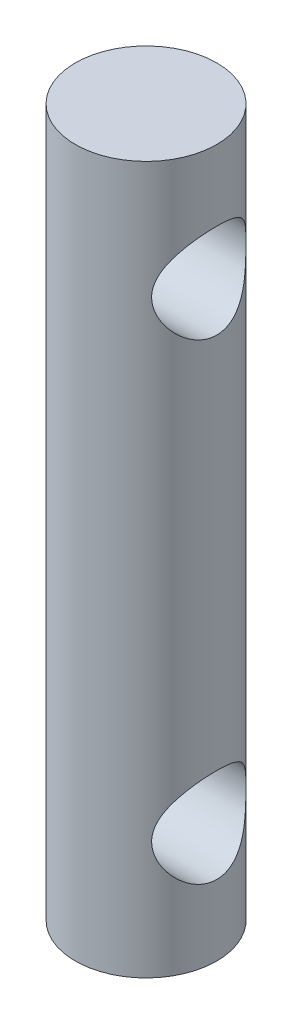
ISO-10303-21;
HEADER;
FILE_DESCRIPTION(('STEP AP214'),'2;1');
FILE_NAME('part.step','',(''),(''),'','','');
FILE_SCHEMA(('AUTOMOTIVE_DESIGN { 1 0 10303 214 1 1 1 1 }'));
ENDSEC;
DATA;
#1=APPLICATION_CONTEXT('core data for automotive mechanical design processes');
#2=APPLICATION_PROTOCOL_DEFINITION('international standard','automotive_design',2000,#1);
#3=PRODUCT_CONTEXT('',#1,'mechanical');
#4=PRODUCT('Part','Part','',(#3));
#5=PRODUCT_RELATED_PRODUCT_CATEGORY('part','',(#4));
#6=PRODUCT_DEFINITION_FORMATION('','',#4);
#7=PRODUCT_DEFINITION_CONTEXT('part definition',#1,'design');
#8=PRODUCT_DEFINITION('design','',#6,#7);
#9=PRODUCT_DEFINITION_SHAPE('','',#8);
#10=(LENGTH_UNIT() NAMED_UNIT(*) SI_UNIT(.MILLI.,.METRE.));
#11=(NAMED_UNIT(*) PLANE_ANGLE_UNIT() SI_UNIT($,.RADIAN.));
#12=(NAMED_UNIT(*) SI_UNIT($,.STERADIAN.) SOLID_ANGLE_UNIT());
#13=UNCERTAINTY_MEASURE_WITH_UNIT(LENGTH_MEASURE(1.E-05),#10,'distance_accuracy_value','');
#14=(GEOMETRIC_REPRESENTATION_CONTEXT(3) GLOBAL_UNCERTAINTY_ASSIGNED_CONTEXT((#13)) GLOBAL_UNIT_ASSIGNED_CONTEXT((#10,
#11,#12)) REPRESENTATION_CONTEXT('',''));
#15=CARTESIAN_POINT('',(0.,0.,0.));
#16=DIRECTION('',(0.,0.,1.));
#17=DIRECTION('',(1.,0.,0.));
#18=AXIS2_PLACEMENT_3D('',#15,#16,#17);
#19=CARTESIAN_POINT('',(0.,30.,0.));
#20=DIRECTION('',(0.,-1.,0.));
#21=DIRECTION('',(0.,0.,1.));
#22=AXIS2_PLACEMENT_3D('',#19,#20,#21);
#23=CYLINDRICAL_SURFACE('',#22,3.);
#24=CARTESIAN_POINT('',(-2.23606797749979,5.,2.));
#25=CARTESIAN_POINT('',(-2.23607753462816,5.09762831086862,1.99999453997731));
#26=CARTESIAN_POINT('',(-2.24258071047442,5.1952907537088,1.99278992503664));
#27=CARTESIAN_POINT('',(-2.26731972501617,5.38711991165081,1.96458268317731));
#28=CARTESIAN_POINT('',(-2.2855766081271,5.48128003552956,1.94355530587862));
#29=CARTESIAN_POINT('',(-2.3305658582557,5.66273544187768,1.88935861676632));
#30=CARTESIAN_POINT('',(-2.35721561794601,5.75008769673766,1.85630718014214));
#31=CARTESIAN_POINT('',(-2.41584094681825,5.91786583234666,1.77934008393538));
#32=CARTESIAN_POINT('',(-2.44781762158831,5.99829026997647,1.73542216812163));
#33=CARTESIAN_POINT('',(-2.51946072932026,6.16364688761691,1.63002410007714));
#34=CARTESIAN_POINT('',(-2.55954936090364,6.2473321177172,1.56687435451732));
#35=CARTESIAN_POINT('',(-2.63944827308083,6.40400270887428,1.4281921974068));
#36=CARTESIAN_POINT('',(-2.67925824297985,6.47697752165853,1.3526477317708));
#37=CARTESIAN_POINT('',(-2.76088818523747,6.62064365878166,1.17815690494296));
#38=CARTESIAN_POINT('',(-2.80216785846923,6.68948251177567,1.07740643965819));
#39=CARTESIAN_POINT('',(-2.87558484482764,6.80864209549007,0.862470964212232));
#40=CARTESIAN_POINT('',(-2.90773236231037,6.85898351403119,0.748301152321704));
#41=CARTESIAN_POINT('',(-2.95599907464725,6.93355640101745,0.523249073480003));
#42=CARTESIAN_POINT('',(-2.97351175615867,6.96008334449556,0.413434725181416));
#43=CARTESIAN_POINT('',(-2.99609745461921,6.99418448928365,0.189695448729862));
#44=CARTESIAN_POINT('',(-3.00118613762359,7.00178255922544,0.0757758812858249));
#45=CARTESIAN_POINT('',(-2.99855361722953,6.99782755005095,-0.13414705023233));
#46=CARTESIAN_POINT('',(-2.99266264910127,6.98901094868294,-0.230240638008753));
#47=CARTESIAN_POINT('',(-2.9720818279002,6.95790894864109,-0.419238633271016));
#48=CARTESIAN_POINT('',(-2.95739133313102,6.93562256769646,-0.512142807649724));
#49=CARTESIAN_POINT('',(-2.92052091703736,6.87880431520542,-0.692077937671169));
#50=CARTESIAN_POINT('',(-2.89837077982679,6.84432111480144,-0.779130623845962));
#51=CARTESIAN_POINT('',(-2.84821104476287,6.76444635704718,-0.946209150653556));
#52=CARTESIAN_POINT('',(-2.82020037745161,6.71905280849849,-1.0262337049694));
#53=CARTESIAN_POINT('',(-2.75618058450702,6.61202126254011,-1.18828429196344));
#54=CARTESIAN_POINT('',(-2.71960408792025,6.54903247664721,-1.26919148099708));
#55=CARTESIAN_POINT('',(-2.64400601826998,6.41210132051968,-1.41998807498305));
#56=CARTESIAN_POINT('',(-2.60498072815232,6.33814205406619,-1.48986013519457));
#57=CARTESIAN_POINT('',(-2.52150044944151,6.16803678978671,-1.62772235326165));
#58=CARTESIAN_POINT('',(-2.47714320008931,6.07022892028551,-1.69373593126354));
#59=CARTESIAN_POINT('',(-2.39475610831095,5.86249016077929,-1.80834874945483));
#60=CARTESIAN_POINT('',(-2.3567157153489,5.7525800055861,-1.85697718654898));
#61=CARTESIAN_POINT('',(-2.30262870306889,5.5552809379269,-1.92332724567776));
#62=CARTESIAN_POINT('',(-2.28340364577667,5.47040662994312,-1.94590791747533));
#63=CARTESIAN_POINT('',(-2.25409039789612,5.29696051018316,-1.97979555580014));
#64=CARTESIAN_POINT('',(-2.24398636782354,5.20839538882738,-1.99112206964395));
#65=CARTESIAN_POINT('',(-2.23447556987372,5.02955701355851,-2.00179400148877));
#66=CARTESIAN_POINT('',(-2.2351153386647,4.93927802147988,-2.00108729753098));
#67=CARTESIAN_POINT('',(-2.24709880368953,4.76031616604496,-1.98761629716365));
#68=CARTESIAN_POINT('',(-2.2584511764885,4.67163465589261,-1.97484222690381));
#69=CARTESIAN_POINT('',(-2.28927977500746,4.50261058245016,-1.93899811187046));
#70=CARTESIAN_POINT('',(-2.30833187069749,4.42207229099742,-1.91646174529973));
#71=CARTESIAN_POINT('',(-2.3522995853365,4.2658737639497,-1.86223041628513));
#72=CARTESIAN_POINT('',(-2.3772171729463,4.19021517703699,-1.83053237805351));
#73=CARTESIAN_POINT('',(-2.43611483596194,4.02979799615248,-1.75163346599563));
#74=CARTESIAN_POINT('',(-2.47091081434316,3.9462431884573,-1.70260028818246));
#75=CARTESIAN_POINT('',(-2.54262514806633,3.78758319738271,-1.59352731501438));
#76=CARTESIAN_POINT('',(-2.57954604947543,3.71248848325755,-1.53347411883828));
#77=CARTESIAN_POINT('',(-2.66075678321007,3.55603765253246,-1.38876657712435));
#78=CARTESIAN_POINT('',(-2.70489452138573,3.47689715175168,-1.30160386514207));
#79=CARTESIAN_POINT('',(-2.78775581841638,3.33418331705971,-1.11309948866219));
#80=CARTESIAN_POINT('',(-2.82648414789457,3.27059622874327,-1.01177047745701));
#81=CARTESIAN_POINT('',(-2.88790821242222,3.17210826108241,-0.817487474821799));
#82=CARTESIAN_POINT('',(-2.91225458111008,3.13404349555963,-0.726662364886322));
#83=CARTESIAN_POINT('',(-2.95278707867041,3.07139280567956,-0.538757079020517));
#84=CARTESIAN_POINT('',(-2.96898009871993,3.04679549714023,-0.441682263858772));
#85=CARTESIAN_POINT('',(-2.99178364026746,3.01230303616124,-0.243369392303446));
#86=CARTESIAN_POINT('',(-2.99835150856533,3.00247332049332,-0.142114836924321));
#87=CARTESIAN_POINT('',(-3.00109821029056,2.99835214858289,0.0608555465807296));
#88=CARTESIAN_POINT('',(-2.99727800938902,3.00405924804382,0.162571330953445));
#89=CARTESIAN_POINT('',(-2.98029555977324,3.0296594890047,0.355757532528103));
#90=CARTESIAN_POINT('',(-2.96783277209856,3.0484909848618,0.447435143070527));
#91=CARTESIAN_POINT('',(-2.93536106206933,3.09823800943089,0.626018422997059));
#92=CARTESIAN_POINT('',(-2.91535096747103,3.12915541534726,0.712923348686888));
#93=CARTESIAN_POINT('',(-2.86791765486194,3.20393870488402,0.885147296608349));
#94=CARTESIAN_POINT('',(-2.84013248946338,3.24845030749508,0.970083589200263));
#95=CARTESIAN_POINT('',(-2.77975408235472,3.34815064462598,1.13155266268318));
#96=CARTESIAN_POINT('',(-2.74715796645263,3.403345767952,1.20808037205002));
#97=CARTESIAN_POINT('',(-2.67392931472394,3.53262890233631,1.36329422201402));
#98=CARTESIAN_POINT('',(-2.6328391387737,3.60832302367403,1.44042679526091));
#99=CARTESIAN_POINT('',(-2.55053357649486,3.77111354154583,1.58160022281595));
#100=CARTESIAN_POINT('',(-2.50931811970155,3.85821838883409,1.64563128323923));
#101=CARTESIAN_POINT('',(-2.43384213590298,4.03586759075529,1.75513253518411));
#102=CARTESIAN_POINT('',(-2.39929086741904,4.12564180995034,1.8016464689721));
#103=CARTESIAN_POINT('',(-2.33747501591023,4.31328444899315,1.88115802340272));
#104=CARTESIAN_POINT('',(-2.31019631295305,4.41113669386215,1.91418190281333));
#105=CARTESIAN_POINT('',(-2.27191051929539,4.59077146842454,1.95936262470908));
#106=CARTESIAN_POINT('',(-2.25863695410151,4.67130823679029,1.97452228373248));
#107=CARTESIAN_POINT('',(-2.24071519216009,4.83455640050454,1.99483915818926));
#108=CARTESIAN_POINT('',(-2.23605987841475,4.91726594426058,2.00000462703715));
#109=CARTESIAN_POINT('',(-2.23606797749979,5.,2.));
#110=B_SPLINE_CURVE_WITH_KNOTS('',3,(#24,#25,#26,#27,#28,#29,#30,#31,#32,#33,#34,#35,#36,#37,
#38,#39,#40,#41,#42,#43,#44,#45,#46,#47,#48,#49,#50,#51,#52,#53,#54,#55,#56,#57,#58,#59,#60,#61,
#62,#63,#64,#65,#66,#67,#68,#69,#70,#71,#72,#73,#74,#75,#76,#77,#78,#79,#80,#81,#82,#83,#84,#85,
#86,#87,#88,#89,#90,#91,#92,#93,#94,#95,#96,#97,#98,#99,#100,#101,#102,#103,#104,#105,#106,#107,
#108,#109),.UNSPECIFIED.,.T.,.F.,(4,2,2,2,2,2,2,2,2,2,2,2,2,2,2,2,2,2,2,2,2,2,2,2,2,2,2,2,2,2,2,
2,2,2,2,2,2,2,2,2,2,2,4),(0.,0.292506930722152,0.585539042259288,0.875772651216275,
1.16606657266549,1.50154677068638,1.83735518436276,2.2216703100629,2.6055542938858,
2.9463748206358,3.28676536688298,3.57539534955742,3.86404638283746,4.15155831973191,
4.43912276903,4.76447525946635,5.09033414796639,5.46678703504944,5.84260469743948,
6.11126090401325,6.37944966235487,6.64880037638036,6.91836943570598,7.17476451706936,
7.43124577644958,7.73899230052352,8.04711556801509,8.42254684520963,8.79764490572581,
9.10070580611699,9.40351012888472,9.70765229266165,10.0117661844615,10.2937678224973,
10.5758132789284,10.874178629859,11.1727229593109,11.5182220628451,11.863978504186,
12.1833412579672,12.5020793664923,12.7501661630426,12.9980479966543),.UNSPECIFIED.);
#111=CARTESIAN_POINT('',(-2.23606797749979,5.,2.));
#112=VERTEX_POINT('',#111);
#113=EDGE_CURVE('E37',#112,#112,#110,.T.);
#114=ORIENTED_EDGE('',*,*,#113,.F.);
#115=EDGE_LOOP('',(#114));
#116=FACE_BOUND('',#115,.T.);
#117=CARTESIAN_POINT('',(2.23606797749979,5.,2.));
#118=CARTESIAN_POINT('',(2.23607753462816,4.90237168913138,1.99999453997731));
#119=CARTESIAN_POINT('',(2.24258071047442,4.8047092462912,1.99278992503664));
#120=CARTESIAN_POINT('',(2.26731972501617,4.61288008834918,1.96458268317731));
#121=CARTESIAN_POINT('',(2.2855766081271,4.51871996447043,1.94355530587862));
#122=CARTESIAN_POINT('',(2.3305658582557,4.33726455812231,1.88935861676632));
#123=CARTESIAN_POINT('',(2.35721561794601,4.24991230326234,1.85630718014214));
#124=CARTESIAN_POINT('',(2.41584094681825,4.08213416765333,1.77934008393539));
#125=CARTESIAN_POINT('',(2.44781762158831,4.00170973002352,1.73542216812163));
#126=CARTESIAN_POINT('',(2.51946072932026,3.83635311238309,1.63002410007714));
#127=CARTESIAN_POINT('',(2.55954936090364,3.7526678822828,1.56687435451732));
#128=CARTESIAN_POINT('',(2.63944827308082,3.59599729112572,1.4281921974068));
#129=CARTESIAN_POINT('',(2.67925824297985,3.52302247834147,1.3526477317708));
#130=CARTESIAN_POINT('',(2.76088818523747,3.37935634121833,1.17815690494296));
#131=CARTESIAN_POINT('',(2.80216785846923,3.31051748822433,1.07740643965819));
#132=CARTESIAN_POINT('',(2.87558484482764,3.19135790450993,0.862470964212235));
#133=CARTESIAN_POINT('',(2.90773236231037,3.14101648596881,0.748301152321707));
#134=CARTESIAN_POINT('',(2.95599907464725,3.06644359898254,0.523249073480006));
#135=CARTESIAN_POINT('',(2.97351175615867,3.03991665550444,0.413434725181419));
#136=CARTESIAN_POINT('',(2.99609745461921,3.00581551071635,0.189695448729864));
#137=CARTESIAN_POINT('',(3.00118613762359,2.99821744077456,0.075775881285827));
#138=CARTESIAN_POINT('',(2.99855361722953,3.00217244994905,-0.134147050232328));
#139=CARTESIAN_POINT('',(2.99266264910127,3.01098905131706,-0.230240638008751));
#140=CARTESIAN_POINT('',(2.9720818279002,3.0420910513589,-0.419238633271014));
#141=CARTESIAN_POINT('',(2.95739133313102,3.06437743230354,-0.512142807649723));
#142=CARTESIAN_POINT('',(2.92052091703736,3.12119568479457,-0.692077937671168));
#143=CARTESIAN_POINT('',(2.89837077982679,3.15567888519855,-0.779130623845961));
#144=CARTESIAN_POINT('',(2.84821104476287,3.23555364295281,-0.946209150653555));
#145=CARTESIAN_POINT('',(2.82020037745161,3.28094719150151,-1.0262337049694));
#146=CARTESIAN_POINT('',(2.75618058450702,3.38797873745989,-1.18828429196344));
#147=CARTESIAN_POINT('',(2.71960408792025,3.45096752335278,-1.26919148099708));
#148=CARTESIAN_POINT('',(2.64400601826998,3.58789867948032,-1.41998807498305));
#149=CARTESIAN_POINT('',(2.60498072815232,3.66185794593381,-1.48986013519457));
#150=CARTESIAN_POINT('',(2.52150044944151,3.83196321021329,-1.62772235326165));
#151=CARTESIAN_POINT('',(2.47714320008932,3.92977107971448,-1.69373593126354));
#152=CARTESIAN_POINT('',(2.39475610831095,4.13750983922071,-1.80834874945483));
#153=CARTESIAN_POINT('',(2.3567157153489,4.2474199944139,-1.85697718654898));
#154=CARTESIAN_POINT('',(2.30262870306889,4.4447190620731,-1.92332724567776));
#155=CARTESIAN_POINT('',(2.28340364577667,4.52959337005687,-1.94590791747533));
#156=CARTESIAN_POINT('',(2.25409039789612,4.70303948981683,-1.97979555580014));
#157=CARTESIAN_POINT('',(2.24398636782354,4.79160461117262,-1.99112206964395));
#158=CARTESIAN_POINT('',(2.23447556987372,4.97044298644149,-2.00179400148877));
#159=CARTESIAN_POINT('',(2.2351153386647,5.06072197852012,-2.00108729753098));
#160=CARTESIAN_POINT('',(2.24709880368953,5.23968383395504,-1.98761629716365));
#161=CARTESIAN_POINT('',(2.2584511764885,5.32836534410738,-1.97484222690381));
#162=CARTESIAN_POINT('',(2.28927977500746,5.49738941754983,-1.93899811187046));
#163=CARTESIAN_POINT('',(2.30833187069749,5.57792770900257,-1.91646174529973));
#164=CARTESIAN_POINT('',(2.3522995853365,5.73412623605029,-1.86223041628513));
#165=CARTESIAN_POINT('',(2.3772171729463,5.80978482296301,-1.83053237805352));
#166=CARTESIAN_POINT('',(2.43611483596194,5.97020200384751,-1.75163346599563));
#167=CARTESIAN_POINT('',(2.47091081434316,6.05375681154269,-1.70260028818246));
#168=CARTESIAN_POINT('',(2.54262514806633,6.21241680261729,-1.59352731501439));
#169=CARTESIAN_POINT('',(2.57954604947543,6.28751151674245,-1.53347411883828));
#170=CARTESIAN_POINT('',(2.66075678321007,6.44396234746753,-1.38876657712435));
#171=CARTESIAN_POINT('',(2.70489452138573,6.52310284824831,-1.30160386514207));
#172=CARTESIAN_POINT('',(2.78775581841638,6.66581668294029,-1.1130994886622));
#173=CARTESIAN_POINT('',(2.82648414789457,6.72940377125672,-1.01177047745701));
#174=CARTESIAN_POINT('',(2.88790821242222,6.82789173891759,-0.817487474821802));
#175=CARTESIAN_POINT('',(2.91225458111008,6.86595650444036,-0.726662364886326));
#176=CARTESIAN_POINT('',(2.95278707867041,6.92860719432044,-0.538757079020521));
#177=CARTESIAN_POINT('',(2.96898009871993,6.95320450285976,-0.441682263858775));
#178=CARTESIAN_POINT('',(2.99178364026746,6.98769696383875,-0.243369392303448));
#179=CARTESIAN_POINT('',(2.99835150856532,6.99752667950667,-0.142114836924323));
#180=CARTESIAN_POINT('',(3.00109821029056,7.0016478514171,0.0608555465807275));
#181=CARTESIAN_POINT('',(2.99727800938902,6.99594075195618,0.162571330953444));
#182=CARTESIAN_POINT('',(2.98029555977324,6.9703405109953,0.355757532528102));
#183=CARTESIAN_POINT('',(2.96783277209856,6.95150901513819,0.447435143070527));
#184=CARTESIAN_POINT('',(2.93536106206933,6.9017619905691,0.626018422997059));
#185=CARTESIAN_POINT('',(2.91535096747103,6.87084458465274,0.712923348686887));
#186=CARTESIAN_POINT('',(2.86791765486194,6.79606129511597,0.885147296608349));
#187=CARTESIAN_POINT('',(2.84013248946338,6.75154969250492,0.970083589200263));
#188=CARTESIAN_POINT('',(2.77975408235472,6.65184935537401,1.13155266268318));
#189=CARTESIAN_POINT('',(2.74715796645263,6.596654232048,1.20808037205002));
#190=CARTESIAN_POINT('',(2.67392931472394,6.46737109766369,1.36329422201402));
#191=CARTESIAN_POINT('',(2.6328391387737,6.39167697632596,1.44042679526091));
#192=CARTESIAN_POINT('',(2.55053357649486,6.22888645845416,1.58160022281596));
#193=CARTESIAN_POINT('',(2.50931811970155,6.14178161116591,1.64563128323923));
#194=CARTESIAN_POINT('',(2.43384213590298,5.96413240924471,1.75513253518411));
#195=CARTESIAN_POINT('',(2.39929086741904,5.87435819004966,1.8016464689721));
#196=CARTESIAN_POINT('',(2.33747501591023,5.68671555100684,1.88115802340272));
#197=CARTESIAN_POINT('',(2.31019631295305,5.58886330613785,1.91418190281333));
#198=CARTESIAN_POINT('',(2.27191051929539,5.40922853157545,1.95936262470908));
#199=CARTESIAN_POINT('',(2.25863695410151,5.3286917632097,1.97452228373248));
#200=CARTESIAN_POINT('',(2.24071519216009,5.16544359949546,1.99483915818926));
#201=CARTESIAN_POINT('',(2.23605987841475,5.08273405573942,2.00000462703715));
#202=CARTESIAN_POINT('',(2.23606797749979,5.,2.));
#203=B_SPLINE_CURVE_WITH_KNOTS('',3,(#117,#118,#119,#120,#121,#122,#123,#124,#125,#126,#127,
#128,#129,#130,#131,#132,#133,#134,#135,#136,#137,#138,#139,#140,#141,#142,#143,#144,#145,#146,
#147,#148,#149,#150,#151,#152,#153,#154,#155,#156,#157,#158,#159,#160,#161,#162,#163,#164,#165,
#166,#167,#168,#169,#170,#171,#172,#173,#174,#175,#176,#177,#178,#179,#180,#181,#182,#183,#184,
#185,#186,#187,#188,#189,#190,#191,#192,#193,#194,#195,#196,#197,#198,#199,#200,#201,#202),
.UNSPECIFIED.,.T.,.F.,(4,2,2,2,2,2,2,2,2,2,2,2,2,2,2,2,2,2,2,2,2,2,2,2,2,2,2,2,2,2,2,2,2,2,2,2,
2,2,2,2,2,2,4),(0.,0.292506930722152,0.585539042259287,0.875772651216273,1.16606657266549,
1.50154677068638,1.83735518436275,2.22167031006289,2.6055542938858,2.94637482063579,
3.28676536688298,3.57539534955742,3.86404638283746,4.15155831973191,4.43912276903,
4.76447525946635,5.09033414796639,5.46678703504944,5.84260469743948,6.11126090401325,
6.37944966235487,6.64880037638037,6.91836943570598,7.17476451706936,7.43124577644958,
7.73899230052352,8.04711556801509,8.42254684520963,8.7976449057258,9.10070580611698,
9.40351012888472,9.70765229266165,10.0117661844615,10.2937678224973,10.5758132789284,
10.874178629859,11.1727229593109,11.5182220628451,11.863978504186,12.1833412579672,
12.5020793664923,12.7501661630426,12.9980479966543),.UNSPECIFIED.);
#204=CARTESIAN_POINT('',(2.23606797749979,5.,2.));
#205=VERTEX_POINT('',#204);
#206=EDGE_CURVE('E89',#205,#205,#203,.T.);
#207=ORIENTED_EDGE('',*,*,#206,.F.);
#208=EDGE_LOOP('',(#207));
#209=FACE_BOUND('',#208,.T.);
#210=CARTESIAN_POINT('',(-2.23606797749979,25.,2.));
#211=CARTESIAN_POINT('',(-2.23607753462816,25.0976283108686,1.99999453997731));
#212=CARTESIAN_POINT('',(-2.24258071047442,25.1952907537088,1.99278992503664));
#213=CARTESIAN_POINT('',(-2.26731972501617,25.3871199116508,1.96458268317731));
#214=CARTESIAN_POINT('',(-2.2855766081271,25.4812800355296,1.94355530587863));
#215=CARTESIAN_POINT('',(-2.3305658582557,25.6627354418777,1.88935861676632));
#216=CARTESIAN_POINT('',(-2.35721561794601,25.7500876967377,1.85630718014214));
#217=CARTESIAN_POINT('',(-2.41584094681825,25.9178658323467,1.77934008393538));
#218=CARTESIAN_POINT('',(-2.44781762158831,25.9982902699765,1.73542216812163));
#219=CARTESIAN_POINT('',(-2.51946072932026,26.1636468876169,1.63002410007714));
#220=CARTESIAN_POINT('',(-2.55954936090364,26.2473321177172,1.56687435451732));
#221=CARTESIAN_POINT('',(-2.63944827308082,26.4040027088743,1.4281921974068));
#222=CARTESIAN_POINT('',(-2.67925824297985,26.4769775216585,1.3526477317708));
#223=CARTESIAN_POINT('',(-2.76088818523747,26.6206436587817,1.17815690494296));
#224=CARTESIAN_POINT('',(-2.80216785846923,26.6894825117757,1.07740643965819));
#225=CARTESIAN_POINT('',(-2.87558484482764,26.8086420954901,0.862470964212235));
#226=CARTESIAN_POINT('',(-2.90773236231037,26.8589835140312,0.748301152321706));
#227=CARTESIAN_POINT('',(-2.95599907464725,26.9335564010175,0.523249073480004));
#228=CARTESIAN_POINT('',(-2.97351175615867,26.9600833444956,0.413434725181418));
#229=CARTESIAN_POINT('',(-2.99609745461921,26.9941844892837,0.189695448729863));
#230=CARTESIAN_POINT('',(-3.00118613762359,27.0017825592254,0.0757758812858258));
#231=CARTESIAN_POINT('',(-2.99855361722953,26.9978275500509,-0.134147050232329));
#232=CARTESIAN_POINT('',(-2.99266264910127,26.9890109486829,-0.230240638008751));
#233=CARTESIAN_POINT('',(-2.9720818279002,26.9579089486411,-0.419238633271014));
#234=CARTESIAN_POINT('',(-2.95739133313102,26.9356225676965,-0.512142807649723));
#235=CARTESIAN_POINT('',(-2.92052091703736,26.8788043152054,-0.692077937671169));
#236=CARTESIAN_POINT('',(-2.89837077982679,26.8443211148014,-0.779130623845961));
#237=CARTESIAN_POINT('',(-2.84821104476287,26.7644463570472,-0.946209150653556));
#238=CARTESIAN_POINT('',(-2.82020037745161,26.7190528084985,-1.0262337049694));
#239=CARTESIAN_POINT('',(-2.75618058450702,26.6120212625401,-1.18828429196344));
#240=CARTESIAN_POINT('',(-2.71960408792025,26.5490324766472,-1.26919148099708));
#241=CARTESIAN_POINT('',(-2.64400601826998,26.4121013205197,-1.41998807498305));
#242=CARTESIAN_POINT('',(-2.60498072815232,26.3381420540662,-1.48986013519457));
#243=CARTESIAN_POINT('',(-2.52150044944152,26.1680367897867,-1.62772235326165));
#244=CARTESIAN_POINT('',(-2.47714320008932,26.0702289202855,-1.69373593126354));
#245=CARTESIAN_POINT('',(-2.39475610831095,25.8624901607793,-1.80834874945483));
#246=CARTESIAN_POINT('',(-2.3567157153489,25.7525800055861,-1.85697718654898));
#247=CARTESIAN_POINT('',(-2.30262870306889,25.5552809379269,-1.92332724567776));
#248=CARTESIAN_POINT('',(-2.28340364577667,25.4704066299431,-1.94590791747533));
#249=CARTESIAN_POINT('',(-2.25409039789612,25.2969605101832,-1.97979555580014));
#250=CARTESIAN_POINT('',(-2.24398636782354,25.2083953888274,-1.99112206964395));
#251=CARTESIAN_POINT('',(-2.23447556987372,25.0295570135585,-2.00179400148877));
#252=CARTESIAN_POINT('',(-2.2351153386647,24.9392780214799,-2.00108729753098));
#253=CARTESIAN_POINT('',(-2.24709880368953,24.760316166045,-1.98761629716365));
#254=CARTESIAN_POINT('',(-2.2584511764885,24.6716346558926,-1.97484222690381));
#255=CARTESIAN_POINT('',(-2.28927977500746,24.5026105824502,-1.93899811187046));
#256=CARTESIAN_POINT('',(-2.30833187069749,24.4220722909974,-1.91646174529973));
#257=CARTESIAN_POINT('',(-2.3522995853365,24.2658737639497,-1.86223041628513));
#258=CARTESIAN_POINT('',(-2.3772171729463,24.190215177037,-1.83053237805352));
#259=CARTESIAN_POINT('',(-2.43611483596194,24.0297979961525,-1.75163346599563));
#260=CARTESIAN_POINT('',(-2.47091081434316,23.9462431884573,-1.70260028818246));
#261=CARTESIAN_POINT('',(-2.54262514806633,23.7875831973827,-1.59352731501439));
#262=CARTESIAN_POINT('',(-2.57954604947543,23.7124884832575,-1.53347411883828));
#263=CARTESIAN_POINT('',(-2.66075678321007,23.5560376525325,-1.38876657712435));
#264=CARTESIAN_POINT('',(-2.70489452138573,23.4768971517517,-1.30160386514207));
#265=CARTESIAN_POINT('',(-2.78775581841638,23.3341833170597,-1.11309948866219));
#266=CARTESIAN_POINT('',(-2.82648414789457,23.2705962287433,-1.011770477457));
#267=CARTESIAN_POINT('',(-2.88790821242222,23.1721082610824,-0.817487474821798));
#268=CARTESIAN_POINT('',(-2.91225458111008,23.1340434955596,-0.726662364886322));
#269=CARTESIAN_POINT('',(-2.95278707867041,23.0713928056796,-0.538757079020516));
#270=CARTESIAN_POINT('',(-2.96898009871993,23.0467954971402,-0.44168226385877));
#271=CARTESIAN_POINT('',(-2.99178364026746,23.0123030361612,-0.243369392303444));
#272=CARTESIAN_POINT('',(-2.99835150856533,23.0024733204933,-0.142114836924318));
#273=CARTESIAN_POINT('',(-3.00109821029056,22.9983521485829,0.060855546580732));
#274=CARTESIAN_POINT('',(-2.99727800938901,23.0040592480438,0.162571330953447));
#275=CARTESIAN_POINT('',(-2.98029555977324,23.0296594890047,0.355757532528106));
#276=CARTESIAN_POINT('',(-2.96783277209856,23.0484909848618,0.44743514307053));
#277=CARTESIAN_POINT('',(-2.93536106206933,23.0982380094309,0.626018422997062));
#278=CARTESIAN_POINT('',(-2.91535096747103,23.1291554153473,0.712923348686889));
#279=CARTESIAN_POINT('',(-2.86791765486194,23.203938704884,0.885147296608351));
#280=CARTESIAN_POINT('',(-2.84013248946338,23.2484503074951,0.970083589200266));
#281=CARTESIAN_POINT('',(-2.77975408235472,23.348150644626,1.13155266268318));
#282=CARTESIAN_POINT('',(-2.74715796645263,23.403345767952,1.20808037205002));
#283=CARTESIAN_POINT('',(-2.67392931472394,23.5326289023363,1.36329422201402));
#284=CARTESIAN_POINT('',(-2.6328391387737,23.608323023674,1.44042679526091));
#285=CARTESIAN_POINT('',(-2.55053357649486,23.7711135415458,1.58160022281596));
#286=CARTESIAN_POINT('',(-2.50931811970154,23.8582183888341,1.64563128323923));
#287=CARTESIAN_POINT('',(-2.43384213590298,24.0358675907553,1.75513253518411));
#288=CARTESIAN_POINT('',(-2.39929086741904,24.1256418099503,1.8016464689721));
#289=CARTESIAN_POINT('',(-2.33747501591022,24.3132844489932,1.88115802340273));
#290=CARTESIAN_POINT('',(-2.31019631295305,24.4111366938622,1.91418190281333));
#291=CARTESIAN_POINT('',(-2.27191051929539,24.5907714684246,1.95936262470908));
#292=CARTESIAN_POINT('',(-2.25863695410151,24.6713082367903,1.97452228373248));
#293=CARTESIAN_POINT('',(-2.24071519216008,24.8345564005045,1.99483915818926));
#294=CARTESIAN_POINT('',(-2.23605987841475,24.9172659442606,2.00000462703715));
#295=CARTESIAN_POINT('',(-2.23606797749979,25.,2.));
#296=B_SPLINE_CURVE_WITH_KNOTS('',3,(#210,#211,#212,#213,#214,#215,#216,#217,#218,#219,#220,
#221,#222,#223,#224,#225,#226,#227,#228,#229,#230,#231,#232,#233,#234,#235,#236,#237,#238,#239,
#240,#241,#242,#243,#244,#245,#246,#247,#248,#249,#250,#251,#252,#253,#254,#255,#256,#257,#258,
#259,#260,#261,#262,#263,#264,#265,#266,#267,#268,#269,#270,#271,#272,#273,#274,#275,#276,#277,
#278,#279,#280,#281,#282,#283,#284,#285,#286,#287,#288,#289,#290,#291,#292,#293,#294,#295),
.UNSPECIFIED.,.T.,.F.,(4,2,2,2,2,2,2,2,2,2,2,2,2,2,2,2,2,2,2,2,2,2,2,2,2,2,2,2,2,2,2,2,2,2,2,2,
2,2,2,2,2,2,4),(0.,0.292506930722154,0.585539042259287,0.875772651216276,1.16606657266549,
1.50154677068638,1.83735518436275,2.22167031006289,2.6055542938858,2.9463748206358,
3.28676536688298,3.57539534955742,3.86404638283746,4.15155831973191,4.43912276903,
4.76447525946635,5.09033414796639,5.46678703504944,5.84260469743948,6.11126090401324,
6.37944966235487,6.64880037638037,6.91836943570598,7.17476451706936,7.43124577644958,
7.73899230052352,8.0471155680151,8.42254684520964,8.79764490572581,9.10070580611699,
9.40351012888473,9.70765229266166,10.0117661844615,10.2937678224973,10.5758132789284,
10.874178629859,11.1727229593109,11.5182220628452,11.8639785041861,12.1833412579672,
12.5020793664923,12.7501661630426,12.9980479966543),.UNSPECIFIED.);
#297=CARTESIAN_POINT('',(-2.23606797749979,25.,2.));
#298=VERTEX_POINT('',#297);
#299=EDGE_CURVE('E50',#298,#298,#296,.T.);
#300=ORIENTED_EDGE('',*,*,#299,.F.);
#301=EDGE_LOOP('',(#300));
#302=FACE_BOUND('',#301,.T.);
#303=CARTESIAN_POINT('',(2.23606797749979,25.,2.));
#304=CARTESIAN_POINT('',(2.23607753462816,24.9023716891314,1.99999453997731));
#305=CARTESIAN_POINT('',(2.24258071047442,24.8047092462912,1.99278992503664));
#306=CARTESIAN_POINT('',(2.26731972501617,24.6128800883492,1.96458268317731));
#307=CARTESIAN_POINT('',(2.2855766081271,24.5187199644704,1.94355530587863));
#308=CARTESIAN_POINT('',(2.3305658582557,24.3372645581223,1.88935861676632));
#309=CARTESIAN_POINT('',(2.35721561794601,24.2499123032623,1.85630718014214));
#310=CARTESIAN_POINT('',(2.41584094681825,24.0821341676533,1.77934008393539));
#311=CARTESIAN_POINT('',(2.44781762158831,24.0017097300235,1.73542216812163));
#312=CARTESIAN_POINT('',(2.51946072932026,23.8363531123831,1.63002410007714));
#313=CARTESIAN_POINT('',(2.55954936090363,23.7526678822828,1.56687435451732));
#314=CARTESIAN_POINT('',(2.63944827308082,23.5959972911257,1.4281921974068));
#315=CARTESIAN_POINT('',(2.67925824297985,23.5230224783415,1.3526477317708));
#316=CARTESIAN_POINT('',(2.76088818523747,23.3793563412183,1.17815690494296));
#317=CARTESIAN_POINT('',(2.80216785846923,23.3105174882243,1.07740643965819));
#318=CARTESIAN_POINT('',(2.87558484482764,23.1913579045099,0.862470964212235));
#319=CARTESIAN_POINT('',(2.90773236231037,23.1410164859688,0.748301152321706));
#320=CARTESIAN_POINT('',(2.95599907464725,23.0664435989825,0.523249073480005));
#321=CARTESIAN_POINT('',(2.97351175615867,23.0399166555044,0.413434725181418));
#322=CARTESIAN_POINT('',(2.99609745461921,23.0058155107163,0.189695448729863));
#323=CARTESIAN_POINT('',(3.00118613762359,22.9982174407746,0.0757758812858258));
#324=CARTESIAN_POINT('',(2.99855361722953,23.0021724499491,-0.134147050232329));
#325=CARTESIAN_POINT('',(2.99266264910127,23.0109890513171,-0.230240638008752));
#326=CARTESIAN_POINT('',(2.9720818279002,23.0420910513589,-0.419238633271015));
#327=CARTESIAN_POINT('',(2.95739133313102,23.0643774323035,-0.512142807649724));
#328=CARTESIAN_POINT('',(2.92052091703736,23.1211956847946,-0.692077937671169));
#329=CARTESIAN_POINT('',(2.89837077982679,23.1556788851986,-0.779130623845962));
#330=CARTESIAN_POINT('',(2.84821104476287,23.2355536429528,-0.946209150653557));
#331=CARTESIAN_POINT('',(2.82020037745161,23.2809471915015,-1.0262337049694));
#332=CARTESIAN_POINT('',(2.75618058450702,23.3879787374599,-1.18828429196344));
#333=CARTESIAN_POINT('',(2.71960408792025,23.4509675233528,-1.26919148099708));
#334=CARTESIAN_POINT('',(2.64400601826998,23.5878986794803,-1.41998807498305));
#335=CARTESIAN_POINT('',(2.60498072815232,23.6618579459338,-1.48986013519457));
#336=CARTESIAN_POINT('',(2.52150044944151,23.8319632102133,-1.62772235326165));
#337=CARTESIAN_POINT('',(2.47714320008931,23.9297710797145,-1.69373593126354));
#338=CARTESIAN_POINT('',(2.39475610831095,24.1375098392207,-1.80834874945483));
#339=CARTESIAN_POINT('',(2.35671571534889,24.2474199944139,-1.85697718654898));
#340=CARTESIAN_POINT('',(2.30262870306889,24.4447190620731,-1.92332724567776));
#341=CARTESIAN_POINT('',(2.28340364577667,24.5295933700569,-1.94590791747533));
#342=CARTESIAN_POINT('',(2.25409039789612,24.7030394898168,-1.97979555580014));
#343=CARTESIAN_POINT('',(2.24398636782354,24.7916046111726,-1.99112206964395));
#344=CARTESIAN_POINT('',(2.23447556987372,24.9704429864415,-2.00179400148877));
#345=CARTESIAN_POINT('',(2.2351153386647,25.0607219785201,-2.00108729753098));
#346=CARTESIAN_POINT('',(2.24709880368953,25.239683833955,-1.98761629716365));
#347=CARTESIAN_POINT('',(2.2584511764885,25.3283653441074,-1.97484222690381));
#348=CARTESIAN_POINT('',(2.28927977500746,25.4973894175498,-1.93899811187046));
#349=CARTESIAN_POINT('',(2.30833187069749,25.5779277090026,-1.91646174529973));
#350=CARTESIAN_POINT('',(2.3522995853365,25.7341262360503,-1.86223041628513));
#351=CARTESIAN_POINT('',(2.3772171729463,25.809784822963,-1.83053237805352));
#352=CARTESIAN_POINT('',(2.43611483596194,25.9702020038475,-1.75163346599563));
#353=CARTESIAN_POINT('',(2.47091081434316,26.0537568115427,-1.70260028818246));
#354=CARTESIAN_POINT('',(2.54262514806633,26.2124168026173,-1.59352731501439));
#355=CARTESIAN_POINT('',(2.57954604947543,26.2875115167425,-1.53347411883828));
#356=CARTESIAN_POINT('',(2.66075678321007,26.4439623474675,-1.38876657712436));
#357=CARTESIAN_POINT('',(2.70489452138573,26.5231028482483,-1.30160386514208));
#358=CARTESIAN_POINT('',(2.78775581841637,26.6658166829403,-1.1130994886622));
#359=CARTESIAN_POINT('',(2.82648414789457,26.7294037712567,-1.01177047745701));
#360=CARTESIAN_POINT('',(2.88790821242221,26.8278917389176,-0.817487474821806));
#361=CARTESIAN_POINT('',(2.91225458111008,26.8659565044404,-0.72666236488633));
#362=CARTESIAN_POINT('',(2.95278707867041,26.9286071943204,-0.538757079020524));
#363=CARTESIAN_POINT('',(2.96898009871993,26.9532045028598,-0.441682263858778));
#364=CARTESIAN_POINT('',(2.99178364026746,26.9876969638388,-0.243369392303451));
#365=CARTESIAN_POINT('',(2.99835150856532,26.9975266795067,-0.142114836924327));
#366=CARTESIAN_POINT('',(3.00109821029056,27.0016478514171,0.0608555465807244));
#367=CARTESIAN_POINT('',(2.99727800938902,26.9959407519562,0.162571330953441));
#368=CARTESIAN_POINT('',(2.98029555977324,26.9703405109953,0.355757532528101));
#369=CARTESIAN_POINT('',(2.96783277209856,26.9515090151382,0.447435143070525));
#370=CARTESIAN_POINT('',(2.93536106206933,26.9017619905691,0.626018422997058));
#371=CARTESIAN_POINT('',(2.91535096747103,26.8708445846527,0.712923348686886));
#372=CARTESIAN_POINT('',(2.86791765486194,26.796061295116,0.885147296608347));
#373=CARTESIAN_POINT('',(2.84013248946338,26.7515496925049,0.970083589200261));
#374=CARTESIAN_POINT('',(2.77975408235472,26.651849355374,1.13155266268318));
#375=CARTESIAN_POINT('',(2.74715796645263,26.596654232048,1.20808037205002));
#376=CARTESIAN_POINT('',(2.67392931472394,26.4673710976637,1.36329422201402));
#377=CARTESIAN_POINT('',(2.6328391387737,26.391676976326,1.44042679526091));
#378=CARTESIAN_POINT('',(2.55053357649486,26.2288864584542,1.58160022281596));
#379=CARTESIAN_POINT('',(2.50931811970155,26.1417816111659,1.64563128323923));
#380=CARTESIAN_POINT('',(2.43384213590298,25.9641324092447,1.75513253518411));
#381=CARTESIAN_POINT('',(2.39929086741904,25.8743581900497,1.8016464689721));
#382=CARTESIAN_POINT('',(2.33747501591023,25.6867155510068,1.88115802340272));
#383=CARTESIAN_POINT('',(2.31019631295305,25.5888633061379,1.91418190281333));
#384=CARTESIAN_POINT('',(2.27191051929539,25.4092285315755,1.95936262470908));
#385=CARTESIAN_POINT('',(2.25863695410151,25.3286917632097,1.97452228373248));
#386=CARTESIAN_POINT('',(2.24071519216008,25.1654435994955,1.99483915818926));
#387=CARTESIAN_POINT('',(2.23605987841475,25.0827340557394,2.00000462703715));
#388=CARTESIAN_POINT('',(2.23606797749979,25.,2.));
#389=B_SPLINE_CURVE_WITH_KNOTS('',3,(#303,#304,#305,#306,#307,#308,#309,#310,#311,#312,#313,
#314,#315,#316,#317,#318,#319,#320,#321,#322,#323,#324,#325,#326,#327,#328,#329,#330,#331,#332,
#333,#334,#335,#336,#337,#338,#339,#340,#341,#342,#343,#344,#345,#346,#347,#348,#349,#350,#351,
#352,#353,#354,#355,#356,#357,#358,#359,#360,#361,#362,#363,#364,#365,#366,#367,#368,#369,#370,
#371,#372,#373,#374,#375,#376,#377,#378,#379,#380,#381,#382,#383,#384,#385,#386,#387,#388),
.UNSPECIFIED.,.T.,.F.,(4,2,2,2,2,2,2,2,2,2,2,2,2,2,2,2,2,2,2,2,2,2,2,2,2,2,2,2,2,2,2,2,2,2,2,2,
2,2,2,2,2,2,4),(0.,0.292506930722154,0.585539042259288,0.875772651216276,1.16606657266549,
1.50154677068637,1.83735518436275,2.22167031006289,2.6055542938858,2.9463748206358,
3.28676536688298,3.57539534955742,3.86404638283746,4.15155831973191,4.43912276903,
4.76447525946635,5.09033414796639,5.46678703504944,5.84260469743948,6.11126090401325,
6.37944966235487,6.64880037638036,6.91836943570598,7.17476451706936,7.43124577644957,
7.73899230052352,8.04711556801509,8.42254684520962,8.7976449057258,9.10070580611698,
9.40351012888472,9.70765229266164,10.0117661844615,10.2937678224973,10.5758132789284,
10.874178629859,11.1727229593109,11.5182220628451,11.863978504186,12.1833412579672,
12.5020793664923,12.7501661630426,12.9980479966543),.UNSPECIFIED.);
#390=CARTESIAN_POINT('',(2.23606797749979,25.,2.));
#391=VERTEX_POINT('',#390);
#392=EDGE_CURVE('E53',#391,#391,#389,.T.);
#393=ORIENTED_EDGE('',*,*,#392,.F.);
#394=EDGE_LOOP('',(#393));
#395=FACE_BOUND('',#394,.T.);
#396=CARTESIAN_POINT('',(0.,30.,0.));
#397=DIRECTION('',(0.,-1.,0.));
#398=DIRECTION('',(0.,0.,-1.));
#399=AXIS2_PLACEMENT_3D('',#396,#397,#398);
#400=CIRCLE('',#399,3.);
#401=CARTESIAN_POINT('',(0.,30.,-3.));
#402=VERTEX_POINT('',#401);
#403=EDGE_CURVE('E10',#402,#402,#400,.T.);
#404=ORIENTED_EDGE('',*,*,#403,.T.);
#405=EDGE_LOOP('',(#404));
#406=FACE_BOUND('',#405,.T.);
#407=CARTESIAN_POINT('',(0.,0.,0.));
#408=DIRECTION('',(0.,-1.,0.));
#409=DIRECTION('',(0.,0.,-1.));
#410=AXIS2_PLACEMENT_3D('',#407,#408,#409);
#411=CIRCLE('',#410,3.);
#412=CARTESIAN_POINT('',(0.,0.,-3.));
#413=VERTEX_POINT('',#412);
#414=EDGE_CURVE('E45',#413,#413,#411,.T.);
#415=ORIENTED_EDGE('',*,*,#414,.F.);
#416=EDGE_LOOP('',(#415));
#417=FACE_BOUND('',#416,.T.);
#418=ADVANCED_FACE('F33',(#116,#209,#302,#395,#406,#417),#23,.T.);
#419=CARTESIAN_POINT('',(0.,30.,0.));
#420=DIRECTION('',(0.,1.,0.));
#421=DIRECTION('',(0.,0.,-1.));
#422=AXIS2_PLACEMENT_3D('',#419,#420,#421);
#423=PLANE('',#422);
#424=ORIENTED_EDGE('',*,*,#403,.F.);
#425=EDGE_LOOP('',(#424));
#426=FACE_BOUND('',#425,.T.);
#427=ADVANCED_FACE('F71',(#426),#423,.T.);
#428=CARTESIAN_POINT('',(0.,0.,0.));
#429=DIRECTION('',(0.,1.,0.));
#430=DIRECTION('',(0.,0.,-1.));
#431=AXIS2_PLACEMENT_3D('',#428,#429,#430);
#432=PLANE('',#431);
#433=ORIENTED_EDGE('',*,*,#414,.T.);
#434=EDGE_LOOP('',(#433));
#435=FACE_BOUND('',#434,.T.);
#436=ADVANCED_FACE('F68',(#435),#432,.F.);
#437=CARTESIAN_POINT('',(-7.5,25.,0.));
#438=DIRECTION('',(1.,0.,0.));
#439=DIRECTION('',(0.,0.,1.));
#440=AXIS2_PLACEMENT_3D('',#437,#438,#439);
#441=CYLINDRICAL_SURFACE('',#440,2.);
#442=ORIENTED_EDGE('',*,*,#392,.T.);
#443=EDGE_LOOP('',(#442));
#444=FACE_BOUND('',#443,.T.);
#445=ORIENTED_EDGE('',*,*,#299,.T.);
#446=EDGE_LOOP('',(#445));
#447=FACE_BOUND('',#446,.T.);
#448=ADVANCED_FACE('F63',(#444,#447),#441,.F.);
#449=CARTESIAN_POINT('',(-7.5,5.,0.));
#450=DIRECTION('',(1.,0.,0.));
#451=DIRECTION('',(0.,0.,1.));
#452=AXIS2_PLACEMENT_3D('',#449,#450,#451);
#453=CYLINDRICAL_SURFACE('',#452,2.);
#454=ORIENTED_EDGE('',*,*,#206,.T.);
#455=EDGE_LOOP('',(#454));
#456=FACE_BOUND('',#455,.T.);
#457=ORIENTED_EDGE('',*,*,#113,.T.);
#458=EDGE_LOOP('',(#457));
#459=FACE_BOUND('',#458,.T.);
#460=ADVANCED_FACE('F67',(#456,#459),#453,.F.);
#461=CLOSED_SHELL('',(#418,#427,#436,#448,#460));
#462=MANIFOLD_SOLID_BREP('B2',#461);
#463=ADVANCED_BREP_SHAPE_REPRESENTATION('',(#18,#462),#14);
#464=SHAPE_DEFINITION_REPRESENTATION(#9,#463);
ENDSEC;
END-ISO-10303-21;
